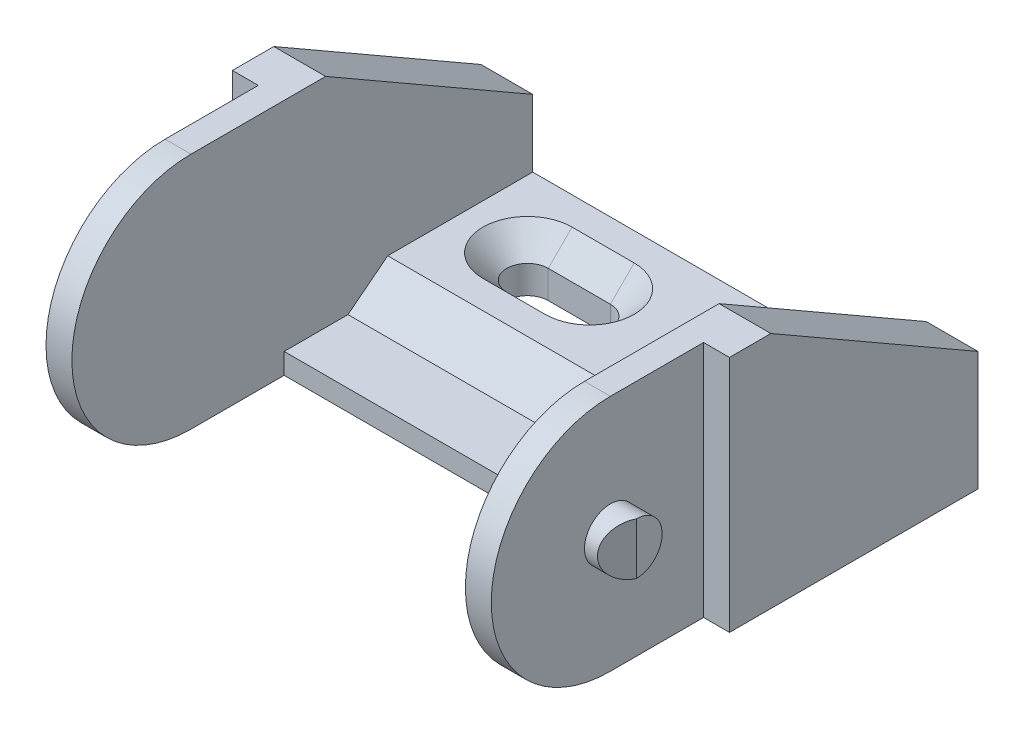
ISO-10303-21;
HEADER;
FILE_DESCRIPTION(('STEP AP214'),'2;1');
FILE_NAME('part.step','',(''),(''),'','','');
FILE_SCHEMA(('AUTOMOTIVE_DESIGN { 1 0 10303 214 1 1 1 1 }'));
ENDSEC;
DATA;
#1=APPLICATION_CONTEXT('core data for automotive mechanical design processes');
#2=APPLICATION_PROTOCOL_DEFINITION('international standard','automotive_design',2000,#1);
#3=PRODUCT_CONTEXT('',#1,'mechanical');
#4=PRODUCT('Part','Part','',(#3));
#5=PRODUCT_RELATED_PRODUCT_CATEGORY('part','',(#4));
#6=PRODUCT_DEFINITION_FORMATION('','',#4);
#7=PRODUCT_DEFINITION_CONTEXT('part definition',#1,'design');
#8=PRODUCT_DEFINITION('design','',#6,#7);
#9=PRODUCT_DEFINITION_SHAPE('','',#8);
#10=(LENGTH_UNIT() NAMED_UNIT(*) SI_UNIT(.MILLI.,.METRE.));
#11=(NAMED_UNIT(*) PLANE_ANGLE_UNIT() SI_UNIT($,.RADIAN.));
#12=(NAMED_UNIT(*) SI_UNIT($,.STERADIAN.) SOLID_ANGLE_UNIT());
#13=UNCERTAINTY_MEASURE_WITH_UNIT(LENGTH_MEASURE(1.E-05),#10,'distance_accuracy_value','');
#14=(GEOMETRIC_REPRESENTATION_CONTEXT(3) GLOBAL_UNCERTAINTY_ASSIGNED_CONTEXT((#13)) GLOBAL_UNIT_ASSIGNED_CONTEXT((#10,
#11,#12)) REPRESENTATION_CONTEXT('',''));
#15=CARTESIAN_POINT('',(0.,0.,0.));
#16=DIRECTION('',(0.,0.,1.));
#17=DIRECTION('',(1.,0.,0.));
#18=AXIS2_PLACEMENT_3D('',#15,#16,#17);
#19=CARTESIAN_POINT('',(24.,-11.5,-16.5));
#20=DIRECTION('',(0.,1.,0.));
#21=DIRECTION('',(0.,0.,1.));
#22=AXIS2_PLACEMENT_3D('',#19,#20,#21);
#23=PLANE('',#22);
#24=CARTESIAN_POINT('',(-6.5,-11.5,-9.5));
#25=DIRECTION('',(0.,-1.,0.));
#26=DIRECTION('',(0.,0.,1.));
#27=AXIS2_PLACEMENT_3D('',#24,#25,#26);
#28=CIRCLE('',#27,2.);
#29=CARTESIAN_POINT('',(-6.5,-11.5,-11.5));
#30=VERTEX_POINT('',#29);
#31=CARTESIAN_POINT('',(-6.5,-11.5,-7.5));
#32=VERTEX_POINT('',#31);
#33=EDGE_CURVE('E271',#30,#32,#28,.T.);
#34=ORIENTED_EDGE('',*,*,#33,.F.);
#35=DIRECTION('',(1.,0.,0.));
#36=VECTOR('',#35,1.);
#37=CARTESIAN_POINT('',(-6.5,-11.5,-11.5));
#38=LINE('',#37,#36);
#39=CARTESIAN_POINT('',(-12.5,-11.5,-11.5));
#40=VERTEX_POINT('',#39);
#41=EDGE_CURVE('E273',#40,#30,#38,.T.);
#42=ORIENTED_EDGE('',*,*,#41,.F.);
#43=CARTESIAN_POINT('',(-12.5,-11.5,-9.5));
#44=DIRECTION('',(0.,-1.,0.));
#45=DIRECTION('',(0.,0.,1.));
#46=AXIS2_PLACEMENT_3D('',#43,#44,#45);
#47=CIRCLE('',#46,2.);
#48=CARTESIAN_POINT('',(-12.5,-11.5,-7.5));
#49=VERTEX_POINT('',#48);
#50=EDGE_CURVE('E276',#49,#40,#47,.T.);
#51=ORIENTED_EDGE('',*,*,#50,.F.);
#52=DIRECTION('',(-1.,0.,0.));
#53=VECTOR('',#52,1.);
#54=CARTESIAN_POINT('',(-6.5,-11.5,-7.5));
#55=LINE('',#54,#53);
#56=EDGE_CURVE('E279',#32,#49,#55,.T.);
#57=ORIENTED_EDGE('',*,*,#56,.F.);
#58=EDGE_LOOP('',(#34,#42,#51,#57));
#59=FACE_BOUND('',#58,.T.);
#60=DIRECTION('',(-1.,0.,0.));
#61=VECTOR('',#60,1.);
#62=CARTESIAN_POINT('',(6.5,-11.5,-11.5));
#63=LINE('',#62,#61);
#64=CARTESIAN_POINT('',(12.5,-11.5,-11.5));
#65=VERTEX_POINT('',#64);
#66=CARTESIAN_POINT('',(6.5,-11.5,-11.5));
#67=VERTEX_POINT('',#66);
#68=EDGE_CURVE('E322',#65,#67,#63,.T.);
#69=ORIENTED_EDGE('',*,*,#68,.T.);
#70=CARTESIAN_POINT('',(6.5,-11.5,-9.5));
#71=DIRECTION('',(0.,1.,0.));
#72=DIRECTION('',(0.,0.,1.));
#73=AXIS2_PLACEMENT_3D('',#70,#71,#72);
#74=CIRCLE('',#73,2.);
#75=CARTESIAN_POINT('',(6.5,-11.5,-7.5));
#76=VERTEX_POINT('',#75);
#77=EDGE_CURVE('E312',#67,#76,#74,.T.);
#78=ORIENTED_EDGE('',*,*,#77,.T.);
#79=DIRECTION('',(1.,0.,0.));
#80=VECTOR('',#79,1.);
#81=CARTESIAN_POINT('',(6.5,-11.5,-7.5));
#82=LINE('',#81,#80);
#83=CARTESIAN_POINT('',(12.5,-11.5,-7.5));
#84=VERTEX_POINT('',#83);
#85=EDGE_CURVE('E315',#76,#84,#82,.T.);
#86=ORIENTED_EDGE('',*,*,#85,.T.);
#87=CARTESIAN_POINT('',(12.5,-11.5,-9.5));
#88=DIRECTION('',(0.,1.,0.));
#89=DIRECTION('',(0.,0.,1.));
#90=AXIS2_PLACEMENT_3D('',#87,#88,#89);
#91=CIRCLE('',#90,2.);
#92=EDGE_CURVE('E319',#84,#65,#91,.T.);
#93=ORIENTED_EDGE('',*,*,#92,.T.);
#94=EDGE_LOOP('',(#69,#78,#86,#93));
#95=FACE_BOUND('',#94,.T.);
#96=DIRECTION('',(-1.,0.,0.));
#97=VECTOR('',#96,1.);
#98=CARTESIAN_POINT('',(-21.5,-11.5,7.5));
#99=LINE('',#98,#97);
#100=CARTESIAN_POINT('',(-21.5,-11.5,7.5));
#101=VERTEX_POINT('',#100);
#102=CARTESIAN_POINT('',(-24.,-11.5,7.5));
#103=VERTEX_POINT('',#102);
#104=EDGE_CURVE('E244',#101,#103,#99,.T.);
#105=ORIENTED_EDGE('',*,*,#104,.T.);
#106=DIRECTION('',(0.,0.,-1.));
#107=VECTOR('',#106,1.);
#108=CARTESIAN_POINT('',(-24.,-11.5,-16.5));
#109=LINE('',#108,#107);
#110=CARTESIAN_POINT('',(-24.,-11.5,-16.5));
#111=VERTEX_POINT('',#110);
#112=EDGE_CURVE('E416',#103,#111,#109,.T.);
#113=ORIENTED_EDGE('',*,*,#112,.T.);
#114=DIRECTION('',(-1.,0.,0.));
#115=VECTOR('',#114,1.);
#116=CARTESIAN_POINT('',(24.,-11.5,-16.5));
#117=LINE('',#116,#115);
#118=CARTESIAN_POINT('',(24.,-11.5,-16.5));
#119=VERTEX_POINT('',#118);
#120=EDGE_CURVE('E421',#119,#111,#117,.T.);
#121=ORIENTED_EDGE('',*,*,#120,.F.);
#122=DIRECTION('',(0.,0.,-1.));
#123=VECTOR('',#122,1.);
#124=CARTESIAN_POINT('',(24.,-11.5,-16.5));
#125=LINE('',#124,#123);
#126=CARTESIAN_POINT('',(24.,-11.5,7.5));
#127=VERTEX_POINT('',#126);
#128=EDGE_CURVE('E419',#127,#119,#125,.T.);
#129=ORIENTED_EDGE('',*,*,#128,.F.);
#130=DIRECTION('',(1.,0.,0.));
#131=VECTOR('',#130,1.);
#132=CARTESIAN_POINT('',(21.5,-11.5,7.5));
#133=LINE('',#132,#131);
#134=CARTESIAN_POINT('',(21.5,-11.5,7.5));
#135=VERTEX_POINT('',#134);
#136=EDGE_CURVE('E307',#135,#127,#133,.T.);
#137=ORIENTED_EDGE('',*,*,#136,.F.);
#138=DIRECTION('',(0.,0.,-1.));
#139=VECTOR('',#138,1.);
#140=CARTESIAN_POINT('',(21.5,-11.5,7.5));
#141=LINE('',#140,#139);
#142=CARTESIAN_POINT('',(21.5,-11.5,16.5));
#143=VERTEX_POINT('',#142);
#144=EDGE_CURVE('E303',#143,#135,#141,.T.);
#145=ORIENTED_EDGE('',*,*,#144,.F.);
#146=DIRECTION('',(-1.,0.,0.));
#147=VECTOR('',#146,1.);
#148=CARTESIAN_POINT('',(24.,-11.5,16.5));
#149=LINE('',#148,#147);
#150=CARTESIAN_POINT('',(19.,-11.5,16.5));
#151=VERTEX_POINT('',#150);
#152=EDGE_CURVE('E430',#143,#151,#149,.T.);
#153=ORIENTED_EDGE('',*,*,#152,.T.);
#154=DIRECTION('',(0.,0.,-1.));
#155=VECTOR('',#154,1.);
#156=CARTESIAN_POINT('',(19.,-11.5,16.5));
#157=LINE('',#156,#155);
#158=CARTESIAN_POINT('',(19.,-11.5,7.5));
#159=VERTEX_POINT('',#158);
#160=EDGE_CURVE('E371',#151,#159,#157,.T.);
#161=ORIENTED_EDGE('',*,*,#160,.T.);
#162=DIRECTION('',(1.,0.,0.));
#163=VECTOR('',#162,1.);
#164=CARTESIAN_POINT('',(-19.,-11.5,7.5));
#165=LINE('',#164,#163);
#166=CARTESIAN_POINT('',(-19.,-11.5,7.5));
#167=VERTEX_POINT('',#166);
#168=EDGE_CURVE('E362',#167,#159,#165,.T.);
#169=ORIENTED_EDGE('',*,*,#168,.F.);
#170=DIRECTION('',(0.,0.,-1.));
#171=VECTOR('',#170,1.);
#172=CARTESIAN_POINT('',(-19.,-11.5,16.5));
#173=LINE('',#172,#171);
#174=CARTESIAN_POINT('',(-19.,-11.5,16.5));
#175=VERTEX_POINT('',#174);
#176=EDGE_CURVE('E345',#175,#167,#173,.T.);
#177=ORIENTED_EDGE('',*,*,#176,.F.);
#178=CARTESIAN_POINT('',(-21.5,-11.5,16.5));
#179=VERTEX_POINT('',#178);
#180=EDGE_CURVE('E262',#175,#179,#149,.T.);
#181=ORIENTED_EDGE('',*,*,#180,.T.);
#182=DIRECTION('',(0.,0.,-1.));
#183=VECTOR('',#182,1.);
#184=CARTESIAN_POINT('',(-21.5,-11.5,7.5));
#185=LINE('',#184,#183);
#186=EDGE_CURVE('E256',#179,#101,#185,.T.);
#187=ORIENTED_EDGE('',*,*,#186,.T.);
#188=EDGE_LOOP('',(#105,#113,#121,#129,#137,#145,#153,#161,#169,#177,#181,#187));
#189=FACE_BOUND('',#188,.T.);
#190=ADVANCED_FACE('F39',(#59,#95,#189),#23,.F.);
#191=CARTESIAN_POINT('',(24.,11.5,-16.5));
#192=DIRECTION('',(0.,-1.,0.));
#193=DIRECTION('',(0.,0.,-1.));
#194=AXIS2_PLACEMENT_3D('',#191,#192,#193);
#195=PLANE('',#194);
#196=DIRECTION('',(-1.,0.,0.));
#197=VECTOR('',#196,1.);
#198=CARTESIAN_POINT('',(-21.5,11.5,7.5));
#199=LINE('',#198,#197);
#200=CARTESIAN_POINT('',(-21.5,11.5,7.5));
#201=VERTEX_POINT('',#200);
#202=CARTESIAN_POINT('',(-24.,11.5,7.5));
#203=VERTEX_POINT('',#202);
#204=EDGE_CURVE('E55',#201,#203,#199,.T.);
#205=ORIENTED_EDGE('',*,*,#204,.F.);
#206=DIRECTION('',(0.,0.,1.));
#207=VECTOR('',#206,1.);
#208=CARTESIAN_POINT('',(-21.5,11.5,7.5));
#209=LINE('',#208,#207);
#210=CARTESIAN_POINT('',(-21.5,11.5,16.5));
#211=VERTEX_POINT('',#210);
#212=EDGE_CURVE('E252',#201,#211,#209,.T.);
#213=ORIENTED_EDGE('',*,*,#212,.T.);
#214=DIRECTION('',(-1.,0.,0.));
#215=VECTOR('',#214,1.);
#216=CARTESIAN_POINT('',(24.,11.5,16.5));
#217=LINE('',#216,#215);
#218=CARTESIAN_POINT('',(-19.,11.5,16.5));
#219=VERTEX_POINT('',#218);
#220=EDGE_CURVE('E432',#219,#211,#217,.T.);
#221=ORIENTED_EDGE('',*,*,#220,.F.);
#222=DIRECTION('',(0.,0.,1.));
#223=VECTOR('',#222,1.);
#224=CARTESIAN_POINT('',(-19.,11.5,3.5));
#225=LINE('',#224,#223);
#226=CARTESIAN_POINT('',(-19.,11.5,3.5));
#227=VERTEX_POINT('',#226);
#228=EDGE_CURVE('E340',#227,#219,#225,.T.);
#229=ORIENTED_EDGE('',*,*,#228,.F.);
#230=DIRECTION('',(1.,0.,0.));
#231=VECTOR('',#230,1.);
#232=CARTESIAN_POINT('',(-24.,11.5,3.5));
#233=LINE('',#232,#231);
#234=CARTESIAN_POINT('',(-24.,11.5,3.5));
#235=VERTEX_POINT('',#234);
#236=EDGE_CURVE('E409',#235,#227,#233,.T.);
#237=ORIENTED_EDGE('',*,*,#236,.F.);
#238=DIRECTION('',(0.,0.,1.));
#239=VECTOR('',#238,1.);
#240=CARTESIAN_POINT('',(-24.,11.5,-16.5));
#241=LINE('',#240,#239);
#242=EDGE_CURVE('E424',#235,#203,#241,.T.);
#243=ORIENTED_EDGE('',*,*,#242,.T.);
#244=EDGE_LOOP('',(#205,#213,#221,#229,#237,#243));
#245=FACE_BOUND('',#244,.T.);
#246=ADVANCED_FACE('F577',(#245),#195,.F.);
#247=CARTESIAN_POINT('',(-24.,0.,16.5));
#248=DIRECTION('',(1.,0.,0.));
#249=DIRECTION('',(0.,0.,-1.));
#250=AXIS2_PLACEMENT_3D('',#247,#248,#249);
#251=PLANE('',#250);
#252=DIRECTION('',(0.,1.,0.));
#253=VECTOR('',#252,1.);
#254=CARTESIAN_POINT('',(-24.,11.5,7.5));
#255=LINE('',#254,#253);
#256=EDGE_CURVE('E248',#103,#203,#255,.T.);
#257=ORIENTED_EDGE('',*,*,#256,.T.);
#258=ORIENTED_EDGE('',*,*,#242,.F.);
#259=DIRECTION('',(0.,-0.498471124258083,-0.866906303057535));
#260=VECTOR('',#259,1.);
#261=CARTESIAN_POINT('',(-24.,0.,-16.5));
#262=LINE('',#261,#260);
#263=CARTESIAN_POINT('',(-24.,0.,-16.5));
#264=VERTEX_POINT('',#263);
#265=EDGE_CURVE('E398',#235,#264,#262,.T.);
#266=ORIENTED_EDGE('',*,*,#265,.T.);
#267=DIRECTION('',(0.,1.,0.));
#268=VECTOR('',#267,1.);
#269=CARTESIAN_POINT('',(-24.,-11.5,-16.5));
#270=LINE('',#269,#268);
#271=EDGE_CURVE('E407',#111,#264,#270,.T.);
#272=ORIENTED_EDGE('',*,*,#271,.F.);
#273=ORIENTED_EDGE('',*,*,#112,.F.);
#274=EDGE_LOOP('',(#257,#258,#266,#272,#273));
#275=FACE_BOUND('',#274,.T.);
#276=ADVANCED_FACE('F529',(#275),#251,.F.);
#277=CARTESIAN_POINT('',(-19.,-6.5,-16.5));
#278=DIRECTION('',(0.,-1.,0.));
#279=DIRECTION('',(0.,0.,-1.));
#280=AXIS2_PLACEMENT_3D('',#277,#278,#279);
#281=PLANE('',#280);
#282=CARTESIAN_POINT('',(-6.5,-6.5,-9.5));
#283=DIRECTION('',(0.,-1.,0.));
#284=DIRECTION('',(0.,0.,-1.));
#285=AXIS2_PLACEMENT_3D('',#282,#283,#284);
#286=CIRCLE('',#285,4.3);
#287=CARTESIAN_POINT('',(-6.5,-6.5,-13.8));
#288=VERTEX_POINT('',#287);
#289=CARTESIAN_POINT('',(-6.5,-6.5,-5.2));
#290=VERTEX_POINT('',#289);
#291=EDGE_CURVE('E471',#288,#290,#286,.T.);
#292=ORIENTED_EDGE('',*,*,#291,.T.);
#293=DIRECTION('',(-1.,0.,0.));
#294=VECTOR('',#293,1.);
#295=CARTESIAN_POINT('',(-12.5,-6.5,-5.2));
#296=LINE('',#295,#294);
#297=CARTESIAN_POINT('',(-12.5,-6.5,-5.2));
#298=VERTEX_POINT('',#297);
#299=EDGE_CURVE('E475',#290,#298,#296,.T.);
#300=ORIENTED_EDGE('',*,*,#299,.T.);
#301=CARTESIAN_POINT('',(-12.5,-6.5,-9.5));
#302=DIRECTION('',(0.,-1.,0.));
#303=DIRECTION('',(0.,0.,-1.));
#304=AXIS2_PLACEMENT_3D('',#301,#302,#303);
#305=CIRCLE('',#304,4.3);
#306=CARTESIAN_POINT('',(-12.5,-6.5,-13.8));
#307=VERTEX_POINT('',#306);
#308=EDGE_CURVE('E473',#298,#307,#305,.T.);
#309=ORIENTED_EDGE('',*,*,#308,.T.);
#310=DIRECTION('',(1.,0.,0.));
#311=VECTOR('',#310,1.);
#312=CARTESIAN_POINT('',(-6.5,-6.5,-13.8));
#313=LINE('',#312,#311);
#314=EDGE_CURVE('E469',#307,#288,#313,.T.);
#315=ORIENTED_EDGE('',*,*,#314,.T.);
#316=EDGE_LOOP('',(#292,#300,#309,#315));
#317=FACE_BOUND('',#316,.T.);
#318=DIRECTION('',(0.,0.,-1.));
#319=VECTOR('',#318,1.);
#320=CARTESIAN_POINT('',(19.,-6.5,-16.5));
#321=LINE('',#320,#319);
#322=CARTESIAN_POINT('',(19.,-6.5,-2.5));
#323=VERTEX_POINT('',#322);
#324=CARTESIAN_POINT('',(19.,-6.5,-16.5));
#325=VERTEX_POINT('',#324);
#326=EDGE_CURVE('E383',#323,#325,#321,.T.);
#327=ORIENTED_EDGE('',*,*,#326,.T.);
#328=DIRECTION('',(1.,0.,0.));
#329=VECTOR('',#328,1.);
#330=CARTESIAN_POINT('',(-19.,-6.5,-16.5));
#331=LINE('',#330,#329);
#332=CARTESIAN_POINT('',(-19.,-6.5,-16.5));
#333=VERTEX_POINT('',#332);
#334=EDGE_CURVE('E387',#333,#325,#331,.T.);
#335=ORIENTED_EDGE('',*,*,#334,.F.);
#336=DIRECTION('',(0.,0.,-1.));
#337=VECTOR('',#336,1.);
#338=CARTESIAN_POINT('',(-19.,-6.5,-16.5));
#339=LINE('',#338,#337);
#340=CARTESIAN_POINT('',(-19.,-6.5,-2.5));
#341=VERTEX_POINT('',#340);
#342=EDGE_CURVE('E357',#341,#333,#339,.T.);
#343=ORIENTED_EDGE('',*,*,#342,.F.);
#344=DIRECTION('',(1.,0.,0.));
#345=VECTOR('',#344,1.);
#346=CARTESIAN_POINT('',(-19.,-6.5,-2.5));
#347=LINE('',#346,#345);
#348=EDGE_CURVE('E391',#341,#323,#347,.T.);
#349=ORIENTED_EDGE('',*,*,#348,.T.);
#350=EDGE_LOOP('',(#327,#335,#343,#349));
#351=FACE_BOUND('',#350,.T.);
#352=CARTESIAN_POINT('',(12.5,-6.5,-9.5));
#353=DIRECTION('',(0.,-1.,0.));
#354=DIRECTION('',(0.,0.,-1.));
#355=AXIS2_PLACEMENT_3D('',#352,#353,#354);
#356=CIRCLE('',#355,4.3);
#357=CARTESIAN_POINT('',(12.5,-6.5,-13.8));
#358=VERTEX_POINT('',#357);
#359=CARTESIAN_POINT('',(12.5,-6.5,-5.2));
#360=VERTEX_POINT('',#359);
#361=EDGE_CURVE('E442',#358,#360,#356,.T.);
#362=ORIENTED_EDGE('',*,*,#361,.T.);
#363=DIRECTION('',(-1.,0.,0.));
#364=VECTOR('',#363,1.);
#365=CARTESIAN_POINT('',(-19.,-6.5,-5.19999999999999));
#366=LINE('',#365,#364);
#367=CARTESIAN_POINT('',(6.5,-6.5,-5.19999999999999));
#368=VERTEX_POINT('',#367);
#369=EDGE_CURVE('E444',#360,#368,#366,.T.);
#370=ORIENTED_EDGE('',*,*,#369,.T.);
#371=CARTESIAN_POINT('',(6.5,-6.5,-9.5));
#372=DIRECTION('',(0.,-1.,0.));
#373=DIRECTION('',(0.,0.,-1.));
#374=AXIS2_PLACEMENT_3D('',#371,#372,#373);
#375=CIRCLE('',#374,4.30000000000001);
#376=CARTESIAN_POINT('',(6.5,-6.5,-13.8));
#377=VERTEX_POINT('',#376);
#378=EDGE_CURVE('E440',#368,#377,#375,.T.);
#379=ORIENTED_EDGE('',*,*,#378,.T.);
#380=DIRECTION('',(1.,0.,0.));
#381=VECTOR('',#380,1.);
#382=CARTESIAN_POINT('',(-19.,-6.5,-13.8));
#383=LINE('',#382,#381);
#384=EDGE_CURVE('E438',#377,#358,#383,.T.);
#385=ORIENTED_EDGE('',*,*,#384,.T.);
#386=EDGE_LOOP('',(#362,#370,#379,#385));
#387=FACE_BOUND('',#386,.T.);
#388=ADVANCED_FACE('F525',(#317,#351,#387),#281,.F.);
#389=CARTESIAN_POINT('',(24.,-11.5,-16.5));
#390=DIRECTION('',(0.,0.,1.));
#391=DIRECTION('',(1.,0.,0.));
#392=AXIS2_PLACEMENT_3D('',#389,#390,#391);
#393=PLANE('',#392);
#394=DIRECTION('',(0.,1.,0.));
#395=VECTOR('',#394,1.);
#396=CARTESIAN_POINT('',(-19.,-6.5,-16.5));
#397=LINE('',#396,#395);
#398=CARTESIAN_POINT('',(-19.,0.,-16.5));
#399=VERTEX_POINT('',#398);
#400=EDGE_CURVE('E360',#333,#399,#397,.T.);
#401=ORIENTED_EDGE('',*,*,#400,.F.);
#402=ORIENTED_EDGE('',*,*,#334,.T.);
#403=DIRECTION('',(0.,1.,0.));
#404=VECTOR('',#403,1.);
#405=CARTESIAN_POINT('',(19.,-6.5,-16.5));
#406=LINE('',#405,#404);
#407=CARTESIAN_POINT('',(19.,0.,-16.5));
#408=VERTEX_POINT('',#407);
#409=EDGE_CURVE('E341',#325,#408,#406,.T.);
#410=ORIENTED_EDGE('',*,*,#409,.T.);
#411=DIRECTION('',(1.,0.,0.));
#412=VECTOR('',#411,1.);
#413=CARTESIAN_POINT('',(-24.,0.,-16.5));
#414=LINE('',#413,#412);
#415=CARTESIAN_POINT('',(24.,0.,-16.5));
#416=VERTEX_POINT('',#415);
#417=EDGE_CURVE('E408',#408,#416,#414,.T.);
#418=ORIENTED_EDGE('',*,*,#417,.T.);
#419=DIRECTION('',(0.,1.,0.));
#420=VECTOR('',#419,1.);
#421=CARTESIAN_POINT('',(24.,-11.5,-16.5));
#422=LINE('',#421,#420);
#423=EDGE_CURVE('E412',#119,#416,#422,.T.);
#424=ORIENTED_EDGE('',*,*,#423,.F.);
#425=ORIENTED_EDGE('',*,*,#120,.T.);
#426=ORIENTED_EDGE('',*,*,#271,.T.);
#427=EDGE_CURVE('E404',#264,#399,#414,.T.);
#428=ORIENTED_EDGE('',*,*,#427,.T.);
#429=EDGE_LOOP('',(#401,#402,#410,#418,#424,#425,#426,#428));
#430=FACE_BOUND('',#429,.T.);
#431=ADVANCED_FACE('F528',(#430),#393,.F.);
#432=CARTESIAN_POINT('',(24.,0.,16.5));
#433=DIRECTION('',(-1.,0.,0.));
#434=DIRECTION('',(0.,0.,1.));
#435=AXIS2_PLACEMENT_3D('',#432,#433,#434);
#436=CYLINDRICAL_SURFACE('',#435,11.5);
#437=ORIENTED_EDGE('',*,*,#220,.T.);
#438=CARTESIAN_POINT('',(-21.5,0.,16.5));
#439=DIRECTION('',(1.,0.,0.));
#440=DIRECTION('',(0.,0.,-1.));
#441=AXIS2_PLACEMENT_3D('',#438,#439,#440);
#442=CIRCLE('',#441,11.5);
#443=EDGE_CURVE('E11',#211,#179,#442,.T.);
#444=ORIENTED_EDGE('',*,*,#443,.T.);
#445=ORIENTED_EDGE('',*,*,#180,.F.);
#446=CARTESIAN_POINT('',(-19.,0.,16.5));
#447=DIRECTION('',(1.,0.,0.));
#448=DIRECTION('',(0.,0.,-1.));
#449=AXIS2_PLACEMENT_3D('',#446,#447,#448);
#450=CIRCLE('',#449,11.5);
#451=EDGE_CURVE('E343',#219,#175,#450,.T.);
#452=ORIENTED_EDGE('',*,*,#451,.F.);
#453=EDGE_LOOP('',(#437,#444,#445,#452));
#454=FACE_BOUND('',#453,.T.);
#455=ADVANCED_FACE('F593',(#454),#436,.T.);
#456=CARTESIAN_POINT('',(-24.,0.,-16.5));
#457=DIRECTION('',(0.,-0.866906303057535,0.498471124258083));
#458=DIRECTION('',(0.,-0.498471124258083,-0.866906303057535));
#459=AXIS2_PLACEMENT_3D('',#456,#457,#458);
#460=PLANE('',#459);
#461=DIRECTION('',(0.,0.498471124258083,0.866906303057535));
#462=VECTOR('',#461,1.);
#463=CARTESIAN_POINT('',(-19.,11.5,3.5));
#464=LINE('',#463,#462);
#465=EDGE_CURVE('E338',#399,#227,#464,.T.);
#466=ORIENTED_EDGE('',*,*,#465,.F.);
#467=ORIENTED_EDGE('',*,*,#427,.F.);
#468=ORIENTED_EDGE('',*,*,#265,.F.);
#469=ORIENTED_EDGE('',*,*,#236,.T.);
#470=EDGE_LOOP('',(#466,#467,#468,#469));
#471=FACE_BOUND('',#470,.T.);
#472=ADVANCED_FACE('F596',(#471),#460,.F.);
#473=DIRECTION('',(0.,0.,1.));
#474=VECTOR('',#473,1.);
#475=CARTESIAN_POINT('',(21.5,11.5,7.5));
#476=LINE('',#475,#474);
#477=CARTESIAN_POINT('',(21.5,11.5,7.5));
#478=VERTEX_POINT('',#477);
#479=CARTESIAN_POINT('',(21.5,11.5,16.5));
#480=VERTEX_POINT('',#479);
#481=EDGE_CURVE('E300',#478,#480,#476,.T.);
#482=ORIENTED_EDGE('',*,*,#481,.F.);
#483=DIRECTION('',(1.,0.,0.));
#484=VECTOR('',#483,1.);
#485=CARTESIAN_POINT('',(21.5,11.5,7.5));
#486=LINE('',#485,#484);
#487=CARTESIAN_POINT('',(24.,11.5,7.5));
#488=VERTEX_POINT('',#487);
#489=EDGE_CURVE('E305',#478,#488,#486,.T.);
#490=ORIENTED_EDGE('',*,*,#489,.T.);
#491=DIRECTION('',(0.,0.,1.));
#492=VECTOR('',#491,1.);
#493=CARTESIAN_POINT('',(24.,11.5,-16.5));
#494=LINE('',#493,#492);
#495=CARTESIAN_POINT('',(24.,11.5,3.5));
#496=VERTEX_POINT('',#495);
#497=EDGE_CURVE('E415',#496,#488,#494,.T.);
#498=ORIENTED_EDGE('',*,*,#497,.F.);
#499=CARTESIAN_POINT('',(19.,11.5,3.5));
#500=VERTEX_POINT('',#499);
#501=EDGE_CURVE('E401',#500,#496,#233,.T.);
#502=ORIENTED_EDGE('',*,*,#501,.F.);
#503=DIRECTION('',(0.,0.,1.));
#504=VECTOR('',#503,1.);
#505=CARTESIAN_POINT('',(19.,11.5,3.5));
#506=LINE('',#505,#504);
#507=CARTESIAN_POINT('',(19.,11.5,16.5));
#508=VERTEX_POINT('',#507);
#509=EDGE_CURVE('E365',#500,#508,#506,.T.);
#510=ORIENTED_EDGE('',*,*,#509,.T.);
#511=EDGE_CURVE('E433',#480,#508,#217,.T.);
#512=ORIENTED_EDGE('',*,*,#511,.F.);
#513=EDGE_LOOP('',(#482,#490,#498,#502,#510,#512));
#514=FACE_BOUND('',#513,.T.);
#515=ADVANCED_FACE('F585',(#514),#195,.F.);
#516=CARTESIAN_POINT('',(21.5,0.,16.5));
#517=DIRECTION('',(-1.,0.,0.));
#518=DIRECTION('',(0.,0.,1.));
#519=AXIS2_PLACEMENT_3D('',#516,#517,#518);
#520=CIRCLE('',#519,11.5);
#521=EDGE_CURVE('E453',#143,#480,#520,.T.);
#522=ORIENTED_EDGE('',*,*,#521,.T.);
#523=ORIENTED_EDGE('',*,*,#511,.T.);
#524=CARTESIAN_POINT('',(19.,0.,16.5));
#525=DIRECTION('',(1.,0.,0.));
#526=DIRECTION('',(0.,0.,-1.));
#527=AXIS2_PLACEMENT_3D('',#524,#525,#526);
#528=CIRCLE('',#527,11.5);
#529=EDGE_CURVE('E368',#508,#151,#528,.T.);
#530=ORIENTED_EDGE('',*,*,#529,.T.);
#531=ORIENTED_EDGE('',*,*,#152,.F.);
#532=EDGE_LOOP('',(#522,#523,#530,#531));
#533=FACE_BOUND('',#532,.T.);
#534=ADVANCED_FACE('F589',(#533),#436,.T.);
#535=CARTESIAN_POINT('',(24.,0.,16.5));
#536=DIRECTION('',(1.,0.,0.));
#537=DIRECTION('',(0.,0.,-1.));
#538=AXIS2_PLACEMENT_3D('',#535,#536,#537);
#539=PLANE('',#538);
#540=DIRECTION('',(0.,1.,0.));
#541=VECTOR('',#540,1.);
#542=CARTESIAN_POINT('',(24.,11.5,7.5));
#543=LINE('',#542,#541);
#544=EDGE_CURVE('E296',#127,#488,#543,.T.);
#545=ORIENTED_EDGE('',*,*,#544,.F.);
#546=ORIENTED_EDGE('',*,*,#128,.T.);
#547=ORIENTED_EDGE('',*,*,#423,.T.);
#548=DIRECTION('',(0.,-0.498471124258083,-0.866906303057535));
#549=VECTOR('',#548,1.);
#550=CARTESIAN_POINT('',(24.,0.,-16.5));
#551=LINE('',#550,#549);
#552=EDGE_CURVE('E390',#496,#416,#551,.T.);
#553=ORIENTED_EDGE('',*,*,#552,.F.);
#554=ORIENTED_EDGE('',*,*,#497,.T.);
#555=EDGE_LOOP('',(#545,#546,#547,#553,#554));
#556=FACE_BOUND('',#555,.T.);
#557=ADVANCED_FACE('F591',(#556),#539,.T.);
#558=ORIENTED_EDGE('',*,*,#417,.F.);
#559=DIRECTION('',(0.,0.498471124258083,0.866906303057535));
#560=VECTOR('',#559,1.);
#561=CARTESIAN_POINT('',(19.,11.5,3.5));
#562=LINE('',#561,#560);
#563=EDGE_CURVE('E329',#408,#500,#562,.T.);
#564=ORIENTED_EDGE('',*,*,#563,.T.);
#565=ORIENTED_EDGE('',*,*,#501,.T.);
#566=ORIENTED_EDGE('',*,*,#552,.T.);
#567=EDGE_LOOP('',(#558,#564,#565,#566));
#568=FACE_BOUND('',#567,.T.);
#569=ADVANCED_FACE('F682',(#568),#460,.F.);
#570=CARTESIAN_POINT('',(-19.,-6.5,-2.5));
#571=DIRECTION('',(0.,-0.788010753606721,-0.61566147532566));
#572=DIRECTION('',(0.,0.61566147532566,-0.788010753606721));
#573=AXIS2_PLACEMENT_3D('',#570,#571,#572);
#574=PLANE('',#573);
#575=DIRECTION('',(0.,0.61566147532566,-0.788010753606721));
#576=VECTOR('',#575,1.);
#577=CARTESIAN_POINT('',(19.,-6.5,-2.5));
#578=LINE('',#577,#576);
#579=CARTESIAN_POINT('',(19.,-9.5,1.33982489657922));
#580=VERTEX_POINT('',#579);
#581=EDGE_CURVE('E380',#580,#323,#578,.T.);
#582=ORIENTED_EDGE('',*,*,#581,.T.);
#583=ORIENTED_EDGE('',*,*,#348,.F.);
#584=DIRECTION('',(0.,0.61566147532566,-0.788010753606721));
#585=VECTOR('',#584,1.);
#586=CARTESIAN_POINT('',(-19.,-6.5,-2.5));
#587=LINE('',#586,#585);
#588=CARTESIAN_POINT('',(-19.,-9.5,1.33982489657922));
#589=VERTEX_POINT('',#588);
#590=EDGE_CURVE('E354',#589,#341,#587,.T.);
#591=ORIENTED_EDGE('',*,*,#590,.F.);
#592=DIRECTION('',(1.,0.,0.));
#593=VECTOR('',#592,1.);
#594=CARTESIAN_POINT('',(-19.,-9.5,1.33982489657922));
#595=LINE('',#594,#593);
#596=EDGE_CURVE('E393',#589,#580,#595,.T.);
#597=ORIENTED_EDGE('',*,*,#596,.T.);
#598=EDGE_LOOP('',(#582,#583,#591,#597));
#599=FACE_BOUND('',#598,.T.);
#600=ADVANCED_FACE('F696',(#599),#574,.F.);
#601=CARTESIAN_POINT('',(-19.,-9.5,1.33982489657922));
#602=DIRECTION('',(0.,-1.,0.));
#603=DIRECTION('',(0.,0.,-1.));
#604=AXIS2_PLACEMENT_3D('',#601,#602,#603);
#605=PLANE('',#604);
#606=DIRECTION('',(0.,0.,-1.));
#607=VECTOR('',#606,1.);
#608=CARTESIAN_POINT('',(19.,-9.5,1.33982489657922));
#609=LINE('',#608,#607);
#610=CARTESIAN_POINT('',(19.,-9.5,7.5));
#611=VERTEX_POINT('',#610);
#612=EDGE_CURVE('E377',#611,#580,#609,.T.);
#613=ORIENTED_EDGE('',*,*,#612,.T.);
#614=ORIENTED_EDGE('',*,*,#596,.F.);
#615=DIRECTION('',(0.,0.,-1.));
#616=VECTOR('',#615,1.);
#617=CARTESIAN_POINT('',(-19.,-9.5,1.33982489657922));
#618=LINE('',#617,#616);
#619=CARTESIAN_POINT('',(-19.,-9.5,7.5));
#620=VERTEX_POINT('',#619);
#621=EDGE_CURVE('E351',#620,#589,#618,.T.);
#622=ORIENTED_EDGE('',*,*,#621,.F.);
#623=DIRECTION('',(1.,0.,0.));
#624=VECTOR('',#623,1.);
#625=CARTESIAN_POINT('',(-19.,-9.5,7.5));
#626=LINE('',#625,#624);
#627=EDGE_CURVE('E395',#620,#611,#626,.T.);
#628=ORIENTED_EDGE('',*,*,#627,.T.);
#629=EDGE_LOOP('',(#613,#614,#622,#628));
#630=FACE_BOUND('',#629,.T.);
#631=ADVANCED_FACE('F701',(#630),#605,.F.);
#632=CARTESIAN_POINT('',(-19.,-9.5,7.5));
#633=DIRECTION('',(0.,0.,-1.));
#634=DIRECTION('',(0.,1.,0.));
#635=AXIS2_PLACEMENT_3D('',#632,#633,#634);
#636=PLANE('',#635);
#637=DIRECTION('',(0.,1.,0.));
#638=VECTOR('',#637,1.);
#639=CARTESIAN_POINT('',(19.,-9.5,7.5));
#640=LINE('',#639,#638);
#641=EDGE_CURVE('E374',#159,#611,#640,.T.);
#642=ORIENTED_EDGE('',*,*,#641,.T.);
#643=ORIENTED_EDGE('',*,*,#627,.F.);
#644=DIRECTION('',(0.,1.,0.));
#645=VECTOR('',#644,1.);
#646=CARTESIAN_POINT('',(-19.,-9.5,7.5));
#647=LINE('',#646,#645);
#648=EDGE_CURVE('E348',#167,#620,#647,.T.);
#649=ORIENTED_EDGE('',*,*,#648,.F.);
#650=ORIENTED_EDGE('',*,*,#168,.T.);
#651=EDGE_LOOP('',(#642,#643,#649,#650));
#652=FACE_BOUND('',#651,.T.);
#653=ADVANCED_FACE('F703',(#652),#636,.F.);
#654=CARTESIAN_POINT('',(-19.,0.,16.5));
#655=DIRECTION('',(1.,0.,0.));
#656=DIRECTION('',(0.,0.,-1.));
#657=AXIS2_PLACEMENT_3D('',#654,#655,#656);
#658=PLANE('',#657);
#659=ORIENTED_EDGE('',*,*,#465,.T.);
#660=ORIENTED_EDGE('',*,*,#228,.T.);
#661=ORIENTED_EDGE('',*,*,#451,.T.);
#662=ORIENTED_EDGE('',*,*,#176,.T.);
#663=ORIENTED_EDGE('',*,*,#648,.T.);
#664=ORIENTED_EDGE('',*,*,#621,.T.);
#665=ORIENTED_EDGE('',*,*,#590,.T.);
#666=ORIENTED_EDGE('',*,*,#342,.T.);
#667=ORIENTED_EDGE('',*,*,#400,.T.);
#668=EDGE_LOOP('',(#659,#660,#661,#662,#663,#664,#665,#666,#667));
#669=FACE_BOUND('',#668,.T.);
#670=ADVANCED_FACE('F716',(#669),#658,.T.);
#671=CARTESIAN_POINT('',(19.,0.,16.5));
#672=DIRECTION('',(1.,0.,0.));
#673=DIRECTION('',(0.,0.,-1.));
#674=AXIS2_PLACEMENT_3D('',#671,#672,#673);
#675=PLANE('',#674);
#676=ORIENTED_EDGE('',*,*,#563,.F.);
#677=ORIENTED_EDGE('',*,*,#409,.F.);
#678=ORIENTED_EDGE('',*,*,#326,.F.);
#679=ORIENTED_EDGE('',*,*,#581,.F.);
#680=ORIENTED_EDGE('',*,*,#612,.F.);
#681=ORIENTED_EDGE('',*,*,#641,.F.);
#682=ORIENTED_EDGE('',*,*,#160,.F.);
#683=ORIENTED_EDGE('',*,*,#529,.F.);
#684=ORIENTED_EDGE('',*,*,#509,.F.);
#685=EDGE_LOOP('',(#676,#677,#678,#679,#680,#681,#682,#683,#684));
#686=FACE_BOUND('',#685,.T.);
#687=ADVANCED_FACE('F573',(#686),#675,.F.);
#688=CARTESIAN_POINT('',(6.5,-11.5,-9.5));
#689=DIRECTION('',(0.,1.,0.));
#690=DIRECTION('',(0.,0.,1.));
#691=AXIS2_PLACEMENT_3D('',#688,#689,#690);
#692=CYLINDRICAL_SURFACE('',#691,2.);
#693=DIRECTION('',(0.,1.,0.));
#694=VECTOR('',#693,1.);
#695=CARTESIAN_POINT('',(6.5,-11.5,-11.5));
#696=LINE('',#695,#694);
#697=CARTESIAN_POINT('',(6.5,-8.79999999999999,-11.5));
#698=VERTEX_POINT('',#697);
#699=EDGE_CURVE('E326',#67,#698,#696,.T.);
#700=ORIENTED_EDGE('',*,*,#699,.T.);
#701=CARTESIAN_POINT('',(6.5,-8.79999999999999,-9.5));
#702=DIRECTION('',(0.,-1.,0.));
#703=DIRECTION('',(0.,0.,-1.));
#704=AXIS2_PLACEMENT_3D('',#701,#702,#703);
#705=CIRCLE('',#704,2.);
#706=CARTESIAN_POINT('',(6.5,-8.79999999999999,-7.5));
#707=VERTEX_POINT('',#706);
#708=EDGE_CURVE('E449',#698,#707,#705,.F.);
#709=ORIENTED_EDGE('',*,*,#708,.T.);
#710=DIRECTION('',(0.,1.,0.));
#711=VECTOR('',#710,1.);
#712=CARTESIAN_POINT('',(6.5,-11.5,-7.5));
#713=LINE('',#712,#711);
#714=EDGE_CURVE('E325',#76,#707,#713,.T.);
#715=ORIENTED_EDGE('',*,*,#714,.F.);
#716=ORIENTED_EDGE('',*,*,#77,.F.);
#717=EDGE_LOOP('',(#700,#709,#715,#716));
#718=FACE_BOUND('',#717,.T.);
#719=ADVANCED_FACE('F556',(#718),#692,.F.);
#720=CARTESIAN_POINT('',(6.5,-11.5,-11.5));
#721=DIRECTION('',(0.,0.,-1.));
#722=DIRECTION('',(0.,1.,0.));
#723=AXIS2_PLACEMENT_3D('',#720,#721,#722);
#724=PLANE('',#723);
#725=DIRECTION('',(0.,1.,0.));
#726=VECTOR('',#725,1.);
#727=CARTESIAN_POINT('',(12.5,-11.5,-11.5));
#728=LINE('',#727,#726);
#729=CARTESIAN_POINT('',(12.5,-8.79999999999999,-11.5));
#730=VERTEX_POINT('',#729);
#731=EDGE_CURVE('E330',#65,#730,#728,.T.);
#732=ORIENTED_EDGE('',*,*,#731,.T.);
#733=DIRECTION('',(-1.,0.,0.));
#734=VECTOR('',#733,1.);
#735=CARTESIAN_POINT('',(6.5,-8.79999999999999,-11.5));
#736=LINE('',#735,#734);
#737=EDGE_CURVE('E451',#730,#698,#736,.T.);
#738=ORIENTED_EDGE('',*,*,#737,.T.);
#739=ORIENTED_EDGE('',*,*,#699,.F.);
#740=ORIENTED_EDGE('',*,*,#68,.F.);
#741=EDGE_LOOP('',(#732,#738,#739,#740));
#742=FACE_BOUND('',#741,.T.);
#743=ADVANCED_FACE('F565',(#742),#724,.F.);
#744=CARTESIAN_POINT('',(12.5,-11.5,-9.5));
#745=DIRECTION('',(0.,1.,0.));
#746=DIRECTION('',(0.,0.,1.));
#747=AXIS2_PLACEMENT_3D('',#744,#745,#746);
#748=CYLINDRICAL_SURFACE('',#747,2.);
#749=DIRECTION('',(0.,1.,0.));
#750=VECTOR('',#749,1.);
#751=CARTESIAN_POINT('',(12.5,-11.5,-7.5));
#752=LINE('',#751,#750);
#753=CARTESIAN_POINT('',(12.5,-8.79999999999999,-7.5));
#754=VERTEX_POINT('',#753);
#755=EDGE_CURVE('E333',#84,#754,#752,.T.);
#756=ORIENTED_EDGE('',*,*,#755,.T.);
#757=CARTESIAN_POINT('',(12.5,-8.79999999999999,-9.5));
#758=DIRECTION('',(0.,-1.,0.));
#759=DIRECTION('',(0.,0.,-1.));
#760=AXIS2_PLACEMENT_3D('',#757,#758,#759);
#761=CIRCLE('',#760,2.);
#762=EDGE_CURVE('E447',#754,#730,#761,.F.);
#763=ORIENTED_EDGE('',*,*,#762,.T.);
#764=ORIENTED_EDGE('',*,*,#731,.F.);
#765=ORIENTED_EDGE('',*,*,#92,.F.);
#766=EDGE_LOOP('',(#756,#763,#764,#765));
#767=FACE_BOUND('',#766,.T.);
#768=ADVANCED_FACE('F552',(#767),#748,.F.);
#769=CARTESIAN_POINT('',(6.5,-11.5,-7.5));
#770=DIRECTION('',(0.,0.,1.));
#771=DIRECTION('',(1.,0.,0.));
#772=AXIS2_PLACEMENT_3D('',#769,#770,#771);
#773=PLANE('',#772);
#774=ORIENTED_EDGE('',*,*,#714,.T.);
#775=DIRECTION('',(1.,0.,0.));
#776=VECTOR('',#775,1.);
#777=CARTESIAN_POINT('',(6.5,-8.79999999999999,-7.5));
#778=LINE('',#777,#776);
#779=EDGE_CURVE('E435',#707,#754,#778,.T.);
#780=ORIENTED_EDGE('',*,*,#779,.T.);
#781=ORIENTED_EDGE('',*,*,#755,.F.);
#782=ORIENTED_EDGE('',*,*,#85,.F.);
#783=EDGE_LOOP('',(#774,#780,#781,#782));
#784=FACE_BOUND('',#783,.T.);
#785=ADVANCED_FACE('F550',(#784),#773,.F.);
#786=CARTESIAN_POINT('',(6.5,-8.79999999999999,-11.5));
#787=DIRECTION('',(0.,-0.70710678118655,-0.707106781186545));
#788=DIRECTION('',(-1.,0.,0.));
#789=AXIS2_PLACEMENT_3D('',#786,#787,#788);
#790=PLANE('',#789);
#791=DIRECTION('',(0.,-0.707106781186545,0.70710678118655));
#792=VECTOR('',#791,1.);
#793=CARTESIAN_POINT('',(12.5,-6.5,-13.8));
#794=LINE('',#793,#792);
#795=EDGE_CURVE('E457',#358,#730,#794,.T.);
#796=ORIENTED_EDGE('',*,*,#795,.F.);
#797=ORIENTED_EDGE('',*,*,#384,.F.);
#798=DIRECTION('',(0.,0.707106781186545,-0.70710678118655));
#799=VECTOR('',#798,1.);
#800=CARTESIAN_POINT('',(6.5,-8.79999999999999,-11.5));
#801=LINE('',#800,#799);
#802=EDGE_CURVE('E316',#698,#377,#801,.T.);
#803=ORIENTED_EDGE('',*,*,#802,.F.);
#804=ORIENTED_EDGE('',*,*,#737,.F.);
#805=EDGE_LOOP('',(#796,#797,#803,#804));
#806=FACE_BOUND('',#805,.T.);
#807=ADVANCED_FACE('F562',(#806),#790,.F.);
#808=CARTESIAN_POINT('',(6.5,-8.79999999999999,-9.5));
#809=DIRECTION('',(0.,1.,0.));
#810=DIRECTION('',(0.,0.,1.));
#811=AXIS2_PLACEMENT_3D('',#808,#809,#810);
#812=CONICAL_SURFACE('',#811,2.,0.785398163397452);
#813=ORIENTED_EDGE('',*,*,#802,.T.);
#814=ORIENTED_EDGE('',*,*,#378,.F.);
#815=DIRECTION('',(0.,0.707106781186545,0.70710678118655));
#816=VECTOR('',#815,1.);
#817=CARTESIAN_POINT('',(6.5,-8.79999999999999,-7.5));
#818=LINE('',#817,#816);
#819=EDGE_CURVE('E455',#707,#368,#818,.T.);
#820=ORIENTED_EDGE('',*,*,#819,.F.);
#821=ORIENTED_EDGE('',*,*,#708,.F.);
#822=EDGE_LOOP('',(#813,#814,#820,#821));
#823=FACE_BOUND('',#822,.T.);
#824=ADVANCED_FACE('F560',(#823),#812,.F.);
#825=CARTESIAN_POINT('',(12.5,-8.79999999999999,-9.5));
#826=DIRECTION('',(0.,1.,0.));
#827=DIRECTION('',(0.,0.,1.));
#828=AXIS2_PLACEMENT_3D('',#825,#826,#827);
#829=CONICAL_SURFACE('',#828,2.,0.785398163397451);
#830=ORIENTED_EDGE('',*,*,#795,.T.);
#831=ORIENTED_EDGE('',*,*,#762,.F.);
#832=DIRECTION('',(0.,-0.707106781186546,-0.70710678118655));
#833=VECTOR('',#832,1.);
#834=CARTESIAN_POINT('',(12.5,-6.5,-5.2));
#835=LINE('',#834,#833);
#836=EDGE_CURVE('E309',#360,#754,#835,.T.);
#837=ORIENTED_EDGE('',*,*,#836,.F.);
#838=ORIENTED_EDGE('',*,*,#361,.F.);
#839=EDGE_LOOP('',(#830,#831,#837,#838));
#840=FACE_BOUND('',#839,.T.);
#841=ADVANCED_FACE('F546',(#840),#829,.F.);
#842=CARTESIAN_POINT('',(6.5,-8.79999999999999,-7.5));
#843=DIRECTION('',(0.,-0.70710678118655,0.707106781186545));
#844=DIRECTION('',(1.,0.,0.));
#845=AXIS2_PLACEMENT_3D('',#842,#843,#844);
#846=PLANE('',#845);
#847=ORIENTED_EDGE('',*,*,#819,.T.);
#848=ORIENTED_EDGE('',*,*,#369,.F.);
#849=ORIENTED_EDGE('',*,*,#836,.T.);
#850=ORIENTED_EDGE('',*,*,#779,.F.);
#851=EDGE_LOOP('',(#847,#848,#849,#850));
#852=FACE_BOUND('',#851,.T.);
#853=ADVANCED_FACE('F541',(#852),#846,.F.);
#854=CARTESIAN_POINT('',(21.5,0.,0.));
#855=DIRECTION('',(-1.,0.,0.));
#856=DIRECTION('',(0.,0.,1.));
#857=AXIS2_PLACEMENT_3D('',#854,#855,#856);
#858=PLANE('',#857);
#859=CARTESIAN_POINT('',(21.5,0.,16.5));
#860=DIRECTION('',(-1.,0.,0.));
#861=DIRECTION('',(0.,0.,1.));
#862=AXIS2_PLACEMENT_3D('',#859,#860,#861);
#863=CIRCLE('',#862,2.5);
#864=CARTESIAN_POINT('',(21.5,0.,19.));
#865=VERTEX_POINT('',#864);
#866=EDGE_CURVE('E463',#865,#865,#863,.F.);
#867=ORIENTED_EDGE('',*,*,#866,.F.);
#868=EDGE_LOOP('',(#867));
#869=FACE_BOUND('',#868,.T.);
#870=ORIENTED_EDGE('',*,*,#521,.F.);
#871=ORIENTED_EDGE('',*,*,#144,.T.);
#872=DIRECTION('',(0.,1.,0.));
#873=VECTOR('',#872,1.);
#874=CARTESIAN_POINT('',(21.5,11.5,7.5));
#875=LINE('',#874,#873);
#876=EDGE_CURVE('E297',#135,#478,#875,.T.);
#877=ORIENTED_EDGE('',*,*,#876,.T.);
#878=ORIENTED_EDGE('',*,*,#481,.T.);
#879=EDGE_LOOP('',(#870,#871,#877,#878));
#880=FACE_BOUND('',#879,.T.);
#881=ADVANCED_FACE('F607',(#869,#880),#858,.F.);
#882=CARTESIAN_POINT('',(21.5,11.5,7.5));
#883=DIRECTION('',(0.,0.,-1.));
#884=DIRECTION('',(0.,1.,0.));
#885=AXIS2_PLACEMENT_3D('',#882,#883,#884);
#886=PLANE('',#885);
#887=ORIENTED_EDGE('',*,*,#544,.T.);
#888=ORIENTED_EDGE('',*,*,#489,.F.);
#889=ORIENTED_EDGE('',*,*,#876,.F.);
#890=ORIENTED_EDGE('',*,*,#136,.T.);
#891=EDGE_LOOP('',(#887,#888,#889,#890));
#892=FACE_BOUND('',#891,.T.);
#893=ADVANCED_FACE('F660',(#892),#886,.F.);
#894=CARTESIAN_POINT('',(24.,0.,16.5));
#895=DIRECTION('',(-1.,0.,0.));
#896=DIRECTION('',(0.,0.,1.));
#897=AXIS2_PLACEMENT_3D('',#894,#895,#896);
#898=CYLINDRICAL_SURFACE('',#897,2.5);
#899=CARTESIAN_POINT('',(24.,0.,16.5));
#900=DIRECTION('',(-0.894427190999916,0.,-0.447213595499958));
#901=DIRECTION('',(-0.447213595499958,0.,0.894427190999916));
#902=AXIS2_PLACEMENT_3D('',#899,#900,#901);
#903=ELLIPSE('',#902,2.79508497187474,2.5);
#904=CARTESIAN_POINT('',(24.,-2.5,16.5));
#905=VERTEX_POINT('',#904);
#906=CARTESIAN_POINT('',(24.,2.5,16.5));
#907=VERTEX_POINT('',#906);
#908=EDGE_CURVE('E284',#905,#907,#903,.T.);
#909=ORIENTED_EDGE('',*,*,#908,.T.);
#910=CARTESIAN_POINT('',(24.,0.,16.5));
#911=DIRECTION('',(1.,0.,0.));
#912=DIRECTION('',(0.,0.,-1.));
#913=AXIS2_PLACEMENT_3D('',#910,#911,#912);
#914=CIRCLE('',#913,2.5);
#915=EDGE_CURVE('E293',#905,#907,#914,.T.);
#916=ORIENTED_EDGE('',*,*,#915,.F.);
#917=EDGE_LOOP('',(#909,#916));
#918=FACE_BOUND('',#917,.T.);
#919=ORIENTED_EDGE('',*,*,#866,.T.);
#920=EDGE_LOOP('',(#919));
#921=FACE_BOUND('',#920,.T.);
#922=ADVANCED_FACE('F656',(#918,#921),#898,.T.);
#923=CARTESIAN_POINT('',(24.,0.,16.5));
#924=DIRECTION('',(1.,0.,0.));
#925=DIRECTION('',(0.,0.,-1.));
#926=AXIS2_PLACEMENT_3D('',#923,#924,#925);
#927=PLANE('',#926);
#928=DIRECTION('',(0.,1.,0.));
#929=VECTOR('',#928,1.);
#930=CARTESIAN_POINT('',(24.,0.,16.5));
#931=LINE('',#930,#929);
#932=EDGE_CURVE('E466',#905,#907,#931,.T.);
#933=ORIENTED_EDGE('',*,*,#932,.F.);
#934=ORIENTED_EDGE('',*,*,#915,.T.);
#935=EDGE_LOOP('',(#933,#934));
#936=FACE_BOUND('',#935,.T.);
#937=ADVANCED_FACE('F652',(#936),#927,.T.);
#938=CARTESIAN_POINT('',(24.,-11.5,16.5));
#939=DIRECTION('',(-0.894427190999916,0.,-0.447213595499958));
#940=DIRECTION('',(-0.447213595499958,0.,0.894427190999916));
#941=AXIS2_PLACEMENT_3D('',#938,#939,#940);
#942=PLANE('',#941);
#943=ORIENTED_EDGE('',*,*,#908,.F.);
#944=ORIENTED_EDGE('',*,*,#932,.T.);
#945=EDGE_LOOP('',(#943,#944));
#946=FACE_BOUND('',#945,.T.);
#947=ADVANCED_FACE('F650',(#946),#942,.F.);
#948=CARTESIAN_POINT('',(-6.5,-11.5,-9.5));
#949=DIRECTION('',(0.,1.,0.));
#950=DIRECTION('',(0.,0.,1.));
#951=AXIS2_PLACEMENT_3D('',#948,#949,#950);
#952=CYLINDRICAL_SURFACE('',#951,2.);
#953=DIRECTION('',(0.,1.,0.));
#954=VECTOR('',#953,1.);
#955=CARTESIAN_POINT('',(-6.5,-11.5,-7.5));
#956=LINE('',#955,#954);
#957=CARTESIAN_POINT('',(-6.5,-8.79999999999999,-7.5));
#958=VERTEX_POINT('',#957);
#959=EDGE_CURVE('E282',#32,#958,#956,.T.);
#960=ORIENTED_EDGE('',*,*,#959,.T.);
#961=CARTESIAN_POINT('',(-6.5,-8.79999999999999,-9.5));
#962=DIRECTION('',(0.,-1.,0.));
#963=DIRECTION('',(0.,0.,-1.));
#964=AXIS2_PLACEMENT_3D('',#961,#962,#963);
#965=CIRCLE('',#964,2.);
#966=CARTESIAN_POINT('',(-6.5,-8.79999999999999,-11.5));
#967=VERTEX_POINT('',#966);
#968=EDGE_CURVE('E63',#958,#967,#965,.F.);
#969=ORIENTED_EDGE('',*,*,#968,.T.);
#970=DIRECTION('',(0.,1.,0.));
#971=VECTOR('',#970,1.);
#972=CARTESIAN_POINT('',(-6.5,-11.5,-11.5));
#973=LINE('',#972,#971);
#974=EDGE_CURVE('E281',#30,#967,#973,.T.);
#975=ORIENTED_EDGE('',*,*,#974,.F.);
#976=ORIENTED_EDGE('',*,*,#33,.T.);
#977=EDGE_LOOP('',(#960,#969,#975,#976));
#978=FACE_BOUND('',#977,.T.);
#979=ADVANCED_FACE('F512',(#978),#952,.F.);
#980=CARTESIAN_POINT('',(-6.5,-11.5,-7.5));
#981=DIRECTION('',(0.,0.,-1.));
#982=DIRECTION('',(-1.,0.,0.));
#983=AXIS2_PLACEMENT_3D('',#980,#981,#982);
#984=PLANE('',#983);
#985=DIRECTION('',(0.,1.,0.));
#986=VECTOR('',#985,1.);
#987=CARTESIAN_POINT('',(-12.5,-11.5,-7.5));
#988=LINE('',#987,#986);
#989=CARTESIAN_POINT('',(-12.5,-8.79999999999999,-7.5));
#990=VERTEX_POINT('',#989);
#991=EDGE_CURVE('E285',#49,#990,#988,.T.);
#992=ORIENTED_EDGE('',*,*,#991,.T.);
#993=DIRECTION('',(1.,0.,0.));
#994=VECTOR('',#993,1.);
#995=CARTESIAN_POINT('',(-6.5,-8.79999999999999,-7.5));
#996=LINE('',#995,#994);
#997=EDGE_CURVE('E478',#990,#958,#996,.T.);
#998=ORIENTED_EDGE('',*,*,#997,.T.);
#999=ORIENTED_EDGE('',*,*,#959,.F.);
#1000=ORIENTED_EDGE('',*,*,#56,.T.);
#1001=EDGE_LOOP('',(#992,#998,#999,#1000));
#1002=FACE_BOUND('',#1001,.T.);
#1003=ADVANCED_FACE('F515',(#1002),#984,.T.);
#1004=CARTESIAN_POINT('',(-12.5,-11.5,-9.5));
#1005=DIRECTION('',(0.,1.,0.));
#1006=DIRECTION('',(0.,0.,1.));
#1007=AXIS2_PLACEMENT_3D('',#1004,#1005,#1006);
#1008=CYLINDRICAL_SURFACE('',#1007,2.);
#1009=DIRECTION('',(0.,1.,0.));
#1010=VECTOR('',#1009,1.);
#1011=CARTESIAN_POINT('',(-12.5,-11.5,-11.5));
#1012=LINE('',#1011,#1010);
#1013=CARTESIAN_POINT('',(-12.5,-8.79999999999999,-11.5));
#1014=VERTEX_POINT('',#1013);
#1015=EDGE_CURVE('E288',#40,#1014,#1012,.T.);
#1016=ORIENTED_EDGE('',*,*,#1015,.T.);
#1017=CARTESIAN_POINT('',(-12.5,-8.79999999999999,-9.5));
#1018=DIRECTION('',(0.,-1.,0.));
#1019=DIRECTION('',(0.,0.,-1.));
#1020=AXIS2_PLACEMENT_3D('',#1017,#1018,#1019);
#1021=CIRCLE('',#1020,2.);
#1022=EDGE_CURVE('E481',#1014,#990,#1021,.F.);
#1023=ORIENTED_EDGE('',*,*,#1022,.T.);
#1024=ORIENTED_EDGE('',*,*,#991,.F.);
#1025=ORIENTED_EDGE('',*,*,#50,.T.);
#1026=EDGE_LOOP('',(#1016,#1023,#1024,#1025));
#1027=FACE_BOUND('',#1026,.T.);
#1028=ADVANCED_FACE('F504',(#1027),#1008,.F.);
#1029=CARTESIAN_POINT('',(-6.5,-11.5,-11.5));
#1030=DIRECTION('',(0.,0.,1.));
#1031=DIRECTION('',(0.,-1.,0.));
#1032=AXIS2_PLACEMENT_3D('',#1029,#1030,#1031);
#1033=PLANE('',#1032);
#1034=ORIENTED_EDGE('',*,*,#974,.T.);
#1035=DIRECTION('',(-1.,0.,0.));
#1036=VECTOR('',#1035,1.);
#1037=CARTESIAN_POINT('',(-12.5,-8.79999999999999,-11.5));
#1038=LINE('',#1037,#1036);
#1039=EDGE_CURVE('E48',#967,#1014,#1038,.T.);
#1040=ORIENTED_EDGE('',*,*,#1039,.T.);
#1041=ORIENTED_EDGE('',*,*,#1015,.F.);
#1042=ORIENTED_EDGE('',*,*,#41,.T.);
#1043=EDGE_LOOP('',(#1034,#1040,#1041,#1042));
#1044=FACE_BOUND('',#1043,.T.);
#1045=ADVANCED_FACE('F502',(#1044),#1033,.T.);
#1046=CARTESIAN_POINT('',(-19.,-6.5,-13.8));
#1047=DIRECTION('',(0.,0.70710678118655,0.707106781186545));
#1048=DIRECTION('',(-1.,0.,0.));
#1049=AXIS2_PLACEMENT_3D('',#1046,#1047,#1048);
#1050=PLANE('',#1049);
#1051=DIRECTION('',(0.,0.707106781186545,-0.70710678118655));
#1052=VECTOR('',#1051,1.);
#1053=CARTESIAN_POINT('',(-12.5,-8.79999999999999,-11.5));
#1054=LINE('',#1053,#1052);
#1055=EDGE_CURVE('E488',#1014,#307,#1054,.T.);
#1056=ORIENTED_EDGE('',*,*,#1055,.F.);
#1057=ORIENTED_EDGE('',*,*,#1039,.F.);
#1058=DIRECTION('',(0.,-0.707106781186545,0.70710678118655));
#1059=VECTOR('',#1058,1.);
#1060=CARTESIAN_POINT('',(-6.5,-6.5,-13.8));
#1061=LINE('',#1060,#1059);
#1062=EDGE_CURVE('E274',#288,#967,#1061,.T.);
#1063=ORIENTED_EDGE('',*,*,#1062,.F.);
#1064=ORIENTED_EDGE('',*,*,#314,.F.);
#1065=EDGE_LOOP('',(#1056,#1057,#1063,#1064));
#1066=FACE_BOUND('',#1065,.T.);
#1067=ADVANCED_FACE('F42',(#1066),#1050,.T.);
#1068=CARTESIAN_POINT('',(-6.5,-6.5,-9.5));
#1069=DIRECTION('',(0.,1.,0.));
#1070=DIRECTION('',(0.,0.,1.));
#1071=AXIS2_PLACEMENT_3D('',#1068,#1069,#1070);
#1072=CONICAL_SURFACE('',#1071,4.3,0.785398163397452);
#1073=ORIENTED_EDGE('',*,*,#1062,.T.);
#1074=ORIENTED_EDGE('',*,*,#968,.F.);
#1075=DIRECTION('',(0.,-0.707106781186545,-0.70710678118655));
#1076=VECTOR('',#1075,1.);
#1077=CARTESIAN_POINT('',(-6.5,-6.5,-5.2));
#1078=LINE('',#1077,#1076);
#1079=EDGE_CURVE('E486',#290,#958,#1078,.T.);
#1080=ORIENTED_EDGE('',*,*,#1079,.F.);
#1081=ORIENTED_EDGE('',*,*,#291,.F.);
#1082=EDGE_LOOP('',(#1073,#1074,#1080,#1081));
#1083=FACE_BOUND('',#1082,.T.);
#1084=ADVANCED_FACE('F494',(#1083),#1072,.F.);
#1085=CARTESIAN_POINT('',(-12.5,-6.5,-9.5));
#1086=DIRECTION('',(0.,1.,0.));
#1087=DIRECTION('',(0.,0.,1.));
#1088=AXIS2_PLACEMENT_3D('',#1085,#1086,#1087);
#1089=CONICAL_SURFACE('',#1088,4.3,0.785398163397452);
#1090=ORIENTED_EDGE('',*,*,#1055,.T.);
#1091=ORIENTED_EDGE('',*,*,#308,.F.);
#1092=DIRECTION('',(0.,0.707106781186545,0.70710678118655));
#1093=VECTOR('',#1092,1.);
#1094=CARTESIAN_POINT('',(-12.5,-8.79999999999999,-7.5));
#1095=LINE('',#1094,#1093);
#1096=EDGE_CURVE('E269',#990,#298,#1095,.T.);
#1097=ORIENTED_EDGE('',*,*,#1096,.F.);
#1098=ORIENTED_EDGE('',*,*,#1022,.F.);
#1099=EDGE_LOOP('',(#1090,#1091,#1097,#1098));
#1100=FACE_BOUND('',#1099,.T.);
#1101=ADVANCED_FACE('F523',(#1100),#1089,.F.);
#1102=CARTESIAN_POINT('',(-19.,-6.5,-5.2));
#1103=DIRECTION('',(0.,0.70710678118655,-0.707106781186546));
#1104=DIRECTION('',(1.,0.,0.));
#1105=AXIS2_PLACEMENT_3D('',#1102,#1103,#1104);
#1106=PLANE('',#1105);
#1107=ORIENTED_EDGE('',*,*,#1079,.T.);
#1108=ORIENTED_EDGE('',*,*,#997,.F.);
#1109=ORIENTED_EDGE('',*,*,#1096,.T.);
#1110=ORIENTED_EDGE('',*,*,#299,.F.);
#1111=EDGE_LOOP('',(#1107,#1108,#1109,#1110));
#1112=FACE_BOUND('',#1111,.T.);
#1113=ADVANCED_FACE('F519',(#1112),#1106,.T.);
#1114=CARTESIAN_POINT('',(-21.5,0.,0.));
#1115=DIRECTION('',(1.,0.,0.));
#1116=DIRECTION('',(0.,0.,1.));
#1117=AXIS2_PLACEMENT_3D('',#1114,#1115,#1116);
#1118=PLANE('',#1117);
#1119=CARTESIAN_POINT('',(-21.5,0.,16.5));
#1120=DIRECTION('',(1.,0.,0.));
#1121=DIRECTION('',(0.,0.,-1.));
#1122=AXIS2_PLACEMENT_3D('',#1119,#1120,#1121);
#1123=CIRCLE('',#1122,2.5);
#1124=CARTESIAN_POINT('',(-21.5,0.,14.));
#1125=VERTEX_POINT('',#1124);
#1126=EDGE_CURVE('E883',#1125,#1125,#1123,.T.);
#1127=ORIENTED_EDGE('',*,*,#1126,.T.);
#1128=EDGE_LOOP('',(#1127));
#1129=FACE_BOUND('',#1128,.T.);
#1130=ORIENTED_EDGE('',*,*,#212,.F.);
#1131=DIRECTION('',(0.,1.,0.));
#1132=VECTOR('',#1131,1.);
#1133=CARTESIAN_POINT('',(-21.5,11.5,7.5));
#1134=LINE('',#1133,#1132);
#1135=EDGE_CURVE('E247',#101,#201,#1134,.T.);
#1136=ORIENTED_EDGE('',*,*,#1135,.F.);
#1137=ORIENTED_EDGE('',*,*,#186,.F.);
#1138=ORIENTED_EDGE('',*,*,#443,.F.);
#1139=EDGE_LOOP('',(#1130,#1136,#1137,#1138));
#1140=FACE_BOUND('',#1139,.T.);
#1141=ADVANCED_FACE('F255',(#1129,#1140),#1118,.F.);
#1142=CARTESIAN_POINT('',(-21.5,11.5,7.5));
#1143=DIRECTION('',(0.,0.,1.));
#1144=DIRECTION('',(0.,-1.,0.));
#1145=AXIS2_PLACEMENT_3D('',#1142,#1143,#1144);
#1146=PLANE('',#1145);
#1147=ORIENTED_EDGE('',*,*,#256,.F.);
#1148=ORIENTED_EDGE('',*,*,#104,.F.);
#1149=ORIENTED_EDGE('',*,*,#1135,.T.);
#1150=ORIENTED_EDGE('',*,*,#204,.T.);
#1151=EDGE_LOOP('',(#1147,#1148,#1149,#1150));
#1152=FACE_BOUND('',#1151,.T.);
#1153=ADVANCED_FACE('F246',(#1152),#1146,.T.);
#1154=CARTESIAN_POINT('',(-24.,0.,16.5));
#1155=DIRECTION('',(1.,0.,0.));
#1156=DIRECTION('',(0.,0.,-1.));
#1157=AXIS2_PLACEMENT_3D('',#1154,#1155,#1156);
#1158=CYLINDRICAL_SURFACE('',#1157,2.5);
#1159=CARTESIAN_POINT('',(-24.,0.,16.5));
#1160=DIRECTION('',(1.,0.,0.));
#1161=DIRECTION('',(0.,0.,-1.));
#1162=AXIS2_PLACEMENT_3D('',#1159,#1160,#1161);
#1163=CIRCLE('',#1162,2.5);
#1164=CARTESIAN_POINT('',(-24.,0.,14.));
#1165=VERTEX_POINT('',#1164);
#1166=EDGE_CURVE('E268',#1165,#1165,#1163,.T.);
#1167=ORIENTED_EDGE('',*,*,#1166,.T.);
#1168=EDGE_LOOP('',(#1167));
#1169=FACE_BOUND('',#1168,.T.);
#1170=ORIENTED_EDGE('',*,*,#1126,.F.);
#1171=EDGE_LOOP('',(#1170));
#1172=FACE_BOUND('',#1171,.T.);
#1173=ADVANCED_FACE('F864',(#1169,#1172),#1158,.T.);
#1174=CARTESIAN_POINT('',(-24.,0.,16.5));
#1175=DIRECTION('',(-1.,0.,0.));
#1176=DIRECTION('',(0.,0.,-1.));
#1177=AXIS2_PLACEMENT_3D('',#1174,#1175,#1176);
#1178=PLANE('',#1177);
#1179=ORIENTED_EDGE('',*,*,#1166,.F.);
#1180=EDGE_LOOP('',(#1179));
#1181=FACE_BOUND('',#1180,.T.);
#1182=ADVANCED_FACE('F871',(#1181),#1178,.T.);
#1183=CLOSED_SHELL('',(#190,#246,#276,#388,#431,#455,#472,#515,#534,#557,#569,#600,#631,#653,
#670,#687,#719,#743,#768,#785,#807,#824,#841,#853,#881,#893,#922,#937,#947,#979,#1003,#1028,
#1045,#1067,#1084,#1101,#1113,#1141,#1153,#1173,#1182));
#1184=MANIFOLD_SOLID_BREP('B2',#1183);
#1185=ADVANCED_BREP_SHAPE_REPRESENTATION('',(#18,#1184),#14);
#1186=SHAPE_DEFINITION_REPRESENTATION(#9,#1185);
ENDSEC;
END-ISO-10303-21;
